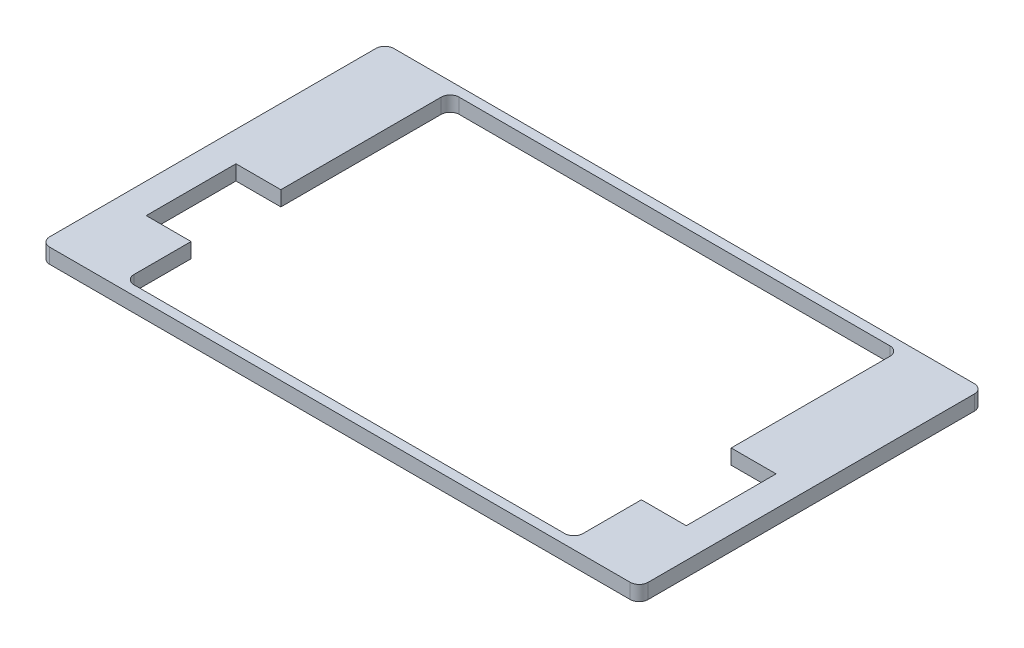
ISO-10303-21;
HEADER;
FILE_DESCRIPTION(('STEP AP214'),'2;1');
FILE_NAME('part.step','',(''),(''),'','','');
FILE_SCHEMA(('AUTOMOTIVE_DESIGN { 1 0 10303 214 1 1 1 1 }'));
ENDSEC;
DATA;
#1=APPLICATION_CONTEXT('core data for automotive mechanical design processes');
#2=APPLICATION_PROTOCOL_DEFINITION('international standard','automotive_design',2000,#1);
#3=PRODUCT_CONTEXT('',#1,'mechanical');
#4=PRODUCT('Part','Part','',(#3));
#5=PRODUCT_RELATED_PRODUCT_CATEGORY('part','',(#4));
#6=PRODUCT_DEFINITION_FORMATION('','',#4);
#7=PRODUCT_DEFINITION_CONTEXT('part definition',#1,'design');
#8=PRODUCT_DEFINITION('design','',#6,#7);
#9=PRODUCT_DEFINITION_SHAPE('','',#8);
#10=(LENGTH_UNIT() NAMED_UNIT(*) SI_UNIT(.MILLI.,.METRE.));
#11=(NAMED_UNIT(*) PLANE_ANGLE_UNIT() SI_UNIT($,.RADIAN.));
#12=(NAMED_UNIT(*) SI_UNIT($,.STERADIAN.) SOLID_ANGLE_UNIT());
#13=UNCERTAINTY_MEASURE_WITH_UNIT(LENGTH_MEASURE(1.E-05),#10,'distance_accuracy_value','');
#14=(GEOMETRIC_REPRESENTATION_CONTEXT(3) GLOBAL_UNCERTAINTY_ASSIGNED_CONTEXT((#13)) GLOBAL_UNIT_ASSIGNED_CONTEXT((#10,
#11,#12)) REPRESENTATION_CONTEXT('',''));
#15=CARTESIAN_POINT('',(0.,0.,0.));
#16=DIRECTION('',(0.,0.,1.));
#17=DIRECTION('',(1.,0.,0.));
#18=AXIS2_PLACEMENT_3D('',#15,#16,#17);
#19=CARTESIAN_POINT('',(222.25,6.35,-138.215));
#20=DIRECTION('',(-1.,0.,0.));
#21=DIRECTION('',(0.,0.,1.));
#22=AXIS2_PLACEMENT_3D('',#19,#20,#21);
#23=PLANE('',#22);
#24=DIRECTION('',(0.,-1.,0.));
#25=VECTOR('',#24,1.);
#26=CARTESIAN_POINT('',(222.25,6.35,-32.7024999999999));
#27=LINE('',#26,#25);
#28=CARTESIAN_POINT('',(222.25,6.35,-32.7024999999999));
#29=VERTEX_POINT('',#28);
#30=CARTESIAN_POINT('',(222.25,0.,-32.7024999999999));
#31=VERTEX_POINT('',#30);
#32=EDGE_CURVE('E226',#29,#31,#27,.T.);
#33=ORIENTED_EDGE('',*,*,#32,.T.);
#34=DIRECTION('',(0.,0.,-1.));
#35=VECTOR('',#34,1.);
#36=CARTESIAN_POINT('',(222.25,0.,-138.215));
#37=LINE('',#36,#35);
#38=CARTESIAN_POINT('',(222.25,0.,-7.835));
#39=VERTEX_POINT('',#38);
#40=EDGE_CURVE('E286',#39,#31,#37,.T.);
#41=ORIENTED_EDGE('',*,*,#40,.F.);
#42=DIRECTION('',(0.,-1.,0.));
#43=VECTOR('',#42,1.);
#44=CARTESIAN_POINT('',(222.25,6.35,-7.835));
#45=LINE('',#44,#43);
#46=CARTESIAN_POINT('',(222.25,6.35,-7.835));
#47=VERTEX_POINT('',#46);
#48=EDGE_CURVE('E312',#47,#39,#45,.T.);
#49=ORIENTED_EDGE('',*,*,#48,.F.);
#50=DIRECTION('',(0.,0.,-1.));
#51=VECTOR('',#50,1.);
#52=CARTESIAN_POINT('',(222.25,6.35,-138.215));
#53=LINE('',#52,#51);
#54=EDGE_CURVE('E262',#47,#29,#53,.T.);
#55=ORIENTED_EDGE('',*,*,#54,.T.);
#56=EDGE_LOOP('',(#33,#41,#49,#55));
#57=FACE_BOUND('',#56,.T.);
#58=ADVANCED_FACE('F34',(#57),#23,.T.);
#59=CARTESIAN_POINT('',(31.7500000000001,6.35,-138.215));
#60=DIRECTION('',(1.,0.,0.));
#61=DIRECTION('',(0.,0.,-1.));
#62=AXIS2_PLACEMENT_3D('',#59,#60,#61);
#63=PLANE('',#62);
#64=DIRECTION('',(0.,-1.,0.));
#65=VECTOR('',#64,1.);
#66=CARTESIAN_POINT('',(31.7500000000001,6.35,-70.1674999999999));
#67=LINE('',#66,#65);
#68=CARTESIAN_POINT('',(31.7500000000001,6.35,-70.1674999999999));
#69=VERTEX_POINT('',#68);
#70=CARTESIAN_POINT('',(31.7500000000001,0.,-70.1674999999999));
#71=VERTEX_POINT('',#70);
#72=EDGE_CURVE('E224',#69,#71,#67,.T.);
#73=ORIENTED_EDGE('',*,*,#72,.T.);
#74=DIRECTION('',(0.,0.,1.));
#75=VECTOR('',#74,1.);
#76=CARTESIAN_POINT('',(31.7500000000001,0.,-138.215));
#77=LINE('',#76,#75);
#78=CARTESIAN_POINT('',(31.7500000000001,0.,-138.215));
#79=VERTEX_POINT('',#78);
#80=EDGE_CURVE('E258',#79,#71,#77,.T.);
#81=ORIENTED_EDGE('',*,*,#80,.F.);
#82=DIRECTION('',(0.,-1.,0.));
#83=VECTOR('',#82,1.);
#84=CARTESIAN_POINT('',(31.7500000000001,6.35,-138.215));
#85=LINE('',#84,#83);
#86=CARTESIAN_POINT('',(31.7500000000001,6.35,-138.215));
#87=VERTEX_POINT('',#86);
#88=EDGE_CURVE('E303',#87,#79,#85,.T.);
#89=ORIENTED_EDGE('',*,*,#88,.F.);
#90=DIRECTION('',(0.,0.,1.));
#91=VECTOR('',#90,1.);
#92=CARTESIAN_POINT('',(31.7500000000001,6.35,-138.215));
#93=LINE('',#92,#91);
#94=EDGE_CURVE('E273',#87,#69,#93,.T.);
#95=ORIENTED_EDGE('',*,*,#94,.T.);
#96=EDGE_LOOP('',(#73,#81,#89,#95));
#97=FACE_BOUND('',#96,.T.);
#98=ADVANCED_FACE('F420',(#97),#63,.T.);
#99=CARTESIAN_POINT('',(250.19,6.35,-3.81));
#100=DIRECTION('',(0.,1.,0.));
#101=DIRECTION('',(0.,0.,1.));
#102=AXIS2_PLACEMENT_3D('',#99,#100,#101);
#103=PLANE('',#102);
#104=DIRECTION('',(-1.,0.,0.));
#105=VECTOR('',#104,1.);
#106=CARTESIAN_POINT('',(222.25,6.35,-32.7024999999999));
#107=LINE('',#106,#105);
#108=CARTESIAN_POINT('',(241.3,6.35,-32.7024999999999));
#109=VERTEX_POINT('',#108);
#110=EDGE_CURVE('E210',#109,#29,#107,.T.);
#111=ORIENTED_EDGE('',*,*,#110,.T.);
#112=ORIENTED_EDGE('',*,*,#54,.F.);
#113=CARTESIAN_POINT('',(218.44,6.35,-7.835));
#114=DIRECTION('',(0.,1.,0.));
#115=DIRECTION('',(0.,0.,1.));
#116=AXIS2_PLACEMENT_3D('',#113,#114,#115);
#117=CIRCLE('',#116,3.81000000000002);
#118=CARTESIAN_POINT('',(218.44,6.35,-4.02499999999998));
#119=VERTEX_POINT('',#118);
#120=EDGE_CURVE('E260',#119,#47,#117,.T.);
#121=ORIENTED_EDGE('',*,*,#120,.F.);
#122=DIRECTION('',(1.,0.,0.));
#123=VECTOR('',#122,1.);
#124=CARTESIAN_POINT('',(35.5600000000001,6.35,-4.025));
#125=LINE('',#124,#123);
#126=CARTESIAN_POINT('',(35.5600000000001,6.35,-4.025));
#127=VERTEX_POINT('',#126);
#128=EDGE_CURVE('E257',#127,#119,#125,.T.);
#129=ORIENTED_EDGE('',*,*,#128,.F.);
#130=CARTESIAN_POINT('',(35.5600000000001,6.35,-7.835));
#131=DIRECTION('',(0.,1.,0.));
#132=DIRECTION('',(0.,0.,1.));
#133=AXIS2_PLACEMENT_3D('',#130,#131,#132);
#134=CIRCLE('',#133,3.81);
#135=CARTESIAN_POINT('',(31.7500000000001,6.35,-7.835));
#136=VERTEX_POINT('',#135);
#137=EDGE_CURVE('E255',#136,#127,#134,.T.);
#138=ORIENTED_EDGE('',*,*,#137,.F.);
#139=CARTESIAN_POINT('',(31.7500000000001,6.35,-32.0674999999999));
#140=VERTEX_POINT('',#139);
#141=EDGE_CURVE('E272',#140,#136,#93,.T.);
#142=ORIENTED_EDGE('',*,*,#141,.F.);
#143=DIRECTION('',(-1.,0.,0.));
#144=VECTOR('',#143,1.);
#145=CARTESIAN_POINT('',(31.7500000000001,6.35,-32.0674999999999));
#146=LINE('',#145,#144);
#147=CARTESIAN_POINT('',(12.7000000000001,6.35,-32.0674999999999));
#148=VERTEX_POINT('',#147);
#149=EDGE_CURVE('E57',#140,#148,#146,.T.);
#150=ORIENTED_EDGE('',*,*,#149,.T.);
#151=DIRECTION('',(0.,0.,-1.));
#152=VECTOR('',#151,1.);
#153=CARTESIAN_POINT('',(12.7000000000001,6.35,-70.1674999999999));
#154=LINE('',#153,#152);
#155=CARTESIAN_POINT('',(12.7000000000001,6.35,-70.1674999999999));
#156=VERTEX_POINT('',#155);
#157=EDGE_CURVE('E233',#148,#156,#154,.T.);
#158=ORIENTED_EDGE('',*,*,#157,.T.);
#159=DIRECTION('',(1.,0.,0.));
#160=VECTOR('',#159,1.);
#161=CARTESIAN_POINT('',(31.7500000000001,6.35,-70.1674999999999));
#162=LINE('',#161,#160);
#163=EDGE_CURVE('E237',#156,#69,#162,.T.);
#164=ORIENTED_EDGE('',*,*,#163,.T.);
#165=ORIENTED_EDGE('',*,*,#94,.F.);
#166=CARTESIAN_POINT('',(35.5600000000001,6.35,-138.215));
#167=DIRECTION('',(0.,1.,0.));
#168=DIRECTION('',(0.,0.,1.));
#169=AXIS2_PLACEMENT_3D('',#166,#167,#168);
#170=CIRCLE('',#169,3.81);
#171=CARTESIAN_POINT('',(35.5600000000001,6.35,-142.025));
#172=VERTEX_POINT('',#171);
#173=EDGE_CURVE('E269',#172,#87,#170,.T.);
#174=ORIENTED_EDGE('',*,*,#173,.F.);
#175=DIRECTION('',(-1.,0.,0.));
#176=VECTOR('',#175,1.);
#177=CARTESIAN_POINT('',(35.5600000000001,6.35,-142.025));
#178=LINE('',#177,#176);
#179=CARTESIAN_POINT('',(218.44,6.35,-142.025));
#180=VERTEX_POINT('',#179);
#181=EDGE_CURVE('E267',#180,#172,#178,.T.);
#182=ORIENTED_EDGE('',*,*,#181,.F.);
#183=CARTESIAN_POINT('',(218.44,6.35,-138.215));
#184=DIRECTION('',(0.,1.,0.));
#185=DIRECTION('',(0.,0.,-1.));
#186=AXIS2_PLACEMENT_3D('',#183,#184,#185);
#187=CIRCLE('',#186,3.81000000000001);
#188=CARTESIAN_POINT('',(222.25,6.35,-138.215));
#189=VERTEX_POINT('',#188);
#190=EDGE_CURVE('E265',#189,#180,#187,.T.);
#191=ORIENTED_EDGE('',*,*,#190,.F.);
#192=CARTESIAN_POINT('',(222.25,6.35,-70.8024999999999));
#193=VERTEX_POINT('',#192);
#194=EDGE_CURVE('E216',#193,#189,#53,.T.);
#195=ORIENTED_EDGE('',*,*,#194,.F.);
#196=DIRECTION('',(1.,0.,0.));
#197=VECTOR('',#196,1.);
#198=CARTESIAN_POINT('',(222.25,6.35,-70.8024999999999));
#199=LINE('',#198,#197);
#200=CARTESIAN_POINT('',(241.3,6.35,-70.8024999999999));
#201=VERTEX_POINT('',#200);
#202=EDGE_CURVE('E49',#193,#201,#199,.T.);
#203=ORIENTED_EDGE('',*,*,#202,.T.);
#204=DIRECTION('',(0.,0.,1.));
#205=VECTOR('',#204,1.);
#206=CARTESIAN_POINT('',(241.3,6.35,-70.8024999999999));
#207=LINE('',#206,#205);
#208=EDGE_CURVE('E205',#201,#109,#207,.T.);
#209=ORIENTED_EDGE('',*,*,#208,.T.);
#210=EDGE_LOOP('',(#111,#112,#121,#129,#138,#142,#150,#158,#164,#165,#174,#182,#191,#195,#203,#209));
#211=FACE_BOUND('',#210,.T.);
#212=CARTESIAN_POINT('',(250.19,6.35,-3.81));
#213=DIRECTION('',(0.,1.,0.));
#214=DIRECTION('',(0.,0.,1.));
#215=AXIS2_PLACEMENT_3D('',#212,#213,#214);
#216=CIRCLE('',#215,3.80999999999999);
#217=CARTESIAN_POINT('',(250.19,6.35,0.));
#218=VERTEX_POINT('',#217);
#219=CARTESIAN_POINT('',(254.,6.35,-3.81));
#220=VERTEX_POINT('',#219);
#221=EDGE_CURVE('E320',#218,#220,#216,.T.);
#222=ORIENTED_EDGE('',*,*,#221,.T.);
#223=DIRECTION('',(0.,0.,-1.));
#224=VECTOR('',#223,1.);
#225=CARTESIAN_POINT('',(254.,6.35,-3.81));
#226=LINE('',#225,#224);
#227=CARTESIAN_POINT('',(254.,6.35,-142.24));
#228=VERTEX_POINT('',#227);
#229=EDGE_CURVE('E323',#220,#228,#226,.T.);
#230=ORIENTED_EDGE('',*,*,#229,.T.);
#231=CARTESIAN_POINT('',(250.19,6.35,-142.24));
#232=DIRECTION('',(0.,1.,0.));
#233=DIRECTION('',(0.,0.,-1.));
#234=AXIS2_PLACEMENT_3D('',#231,#232,#233);
#235=CIRCLE('',#234,3.81000000000002);
#236=CARTESIAN_POINT('',(250.19,6.35,-146.05));
#237=VERTEX_POINT('',#236);
#238=EDGE_CURVE('E326',#228,#237,#235,.T.);
#239=ORIENTED_EDGE('',*,*,#238,.T.);
#240=DIRECTION('',(-1.,0.,0.));
#241=VECTOR('',#240,1.);
#242=CARTESIAN_POINT('',(3.81,6.35,-146.05));
#243=LINE('',#242,#241);
#244=CARTESIAN_POINT('',(3.81,6.35,-146.05));
#245=VERTEX_POINT('',#244);
#246=EDGE_CURVE('E328',#237,#245,#243,.T.);
#247=ORIENTED_EDGE('',*,*,#246,.T.);
#248=CARTESIAN_POINT('',(3.81,6.35,-142.24));
#249=DIRECTION('',(0.,1.,0.));
#250=DIRECTION('',(0.,0.,-1.));
#251=AXIS2_PLACEMENT_3D('',#248,#249,#250);
#252=CIRCLE('',#251,3.81);
#253=CARTESIAN_POINT('',(0.,6.35,-142.24));
#254=VERTEX_POINT('',#253);
#255=EDGE_CURVE('E330',#245,#254,#252,.T.);
#256=ORIENTED_EDGE('',*,*,#255,.T.);
#257=DIRECTION('',(0.,0.,1.));
#258=VECTOR('',#257,1.);
#259=CARTESIAN_POINT('',(0.,6.35,-3.81000000000003));
#260=LINE('',#259,#258);
#261=CARTESIAN_POINT('',(0.,6.35,-3.81000000000003));
#262=VERTEX_POINT('',#261);
#263=EDGE_CURVE('E332',#254,#262,#260,.T.);
#264=ORIENTED_EDGE('',*,*,#263,.T.);
#265=CARTESIAN_POINT('',(3.81,6.35,-3.81));
#266=DIRECTION('',(0.,1.,0.));
#267=DIRECTION('',(0.,0.,-1.));
#268=AXIS2_PLACEMENT_3D('',#265,#266,#267);
#269=CIRCLE('',#268,3.81);
#270=CARTESIAN_POINT('',(3.81000000000003,6.35,0.));
#271=VERTEX_POINT('',#270);
#272=EDGE_CURVE('E334',#262,#271,#269,.T.);
#273=ORIENTED_EDGE('',*,*,#272,.T.);
#274=DIRECTION('',(1.,0.,0.));
#275=VECTOR('',#274,1.);
#276=CARTESIAN_POINT('',(3.81000000000003,6.35,0.));
#277=LINE('',#276,#275);
#278=EDGE_CURVE('E336',#271,#218,#277,.T.);
#279=ORIENTED_EDGE('',*,*,#278,.T.);
#280=EDGE_LOOP('',(#222,#230,#239,#247,#256,#264,#273,#279));
#281=FACE_BOUND('',#280,.T.);
#282=ADVANCED_FACE('F213',(#211,#281),#103,.T.);
#283=CARTESIAN_POINT('',(250.19,0.,-3.81));
#284=DIRECTION('',(0.,1.,0.));
#285=DIRECTION('',(0.,0.,1.));
#286=AXIS2_PLACEMENT_3D('',#283,#284,#285);
#287=PLANE('',#286);
#288=CARTESIAN_POINT('',(250.19,0.,-3.81));
#289=DIRECTION('',(0.,1.,0.));
#290=DIRECTION('',(0.,0.,1.));
#291=AXIS2_PLACEMENT_3D('',#288,#289,#290);
#292=CIRCLE('',#291,3.80999999999999);
#293=CARTESIAN_POINT('',(250.19,0.,0.));
#294=VERTEX_POINT('',#293);
#295=CARTESIAN_POINT('',(254.,0.,-3.81));
#296=VERTEX_POINT('',#295);
#297=EDGE_CURVE('E319',#294,#296,#292,.T.);
#298=ORIENTED_EDGE('',*,*,#297,.F.);
#299=DIRECTION('',(1.,0.,0.));
#300=VECTOR('',#299,1.);
#301=CARTESIAN_POINT('',(3.81000000000003,0.,0.));
#302=LINE('',#301,#300);
#303=CARTESIAN_POINT('',(3.81000000000003,0.,0.));
#304=VERTEX_POINT('',#303);
#305=EDGE_CURVE('E324',#304,#294,#302,.T.);
#306=ORIENTED_EDGE('',*,*,#305,.F.);
#307=CARTESIAN_POINT('',(3.81,0.,-3.81));
#308=DIRECTION('',(0.,1.,0.));
#309=DIRECTION('',(0.,0.,-1.));
#310=AXIS2_PLACEMENT_3D('',#307,#308,#309);
#311=CIRCLE('',#310,3.81);
#312=CARTESIAN_POINT('',(0.,0.,-3.81000000000003));
#313=VERTEX_POINT('',#312);
#314=EDGE_CURVE('E351',#313,#304,#311,.T.);
#315=ORIENTED_EDGE('',*,*,#314,.F.);
#316=DIRECTION('',(0.,0.,1.));
#317=VECTOR('',#316,1.);
#318=CARTESIAN_POINT('',(0.,0.,-3.81000000000003));
#319=LINE('',#318,#317);
#320=CARTESIAN_POINT('',(0.,0.,-142.24));
#321=VERTEX_POINT('',#320);
#322=EDGE_CURVE('E349',#321,#313,#319,.T.);
#323=ORIENTED_EDGE('',*,*,#322,.F.);
#324=CARTESIAN_POINT('',(3.81,0.,-142.24));
#325=DIRECTION('',(0.,1.,0.));
#326=DIRECTION('',(0.,0.,-1.));
#327=AXIS2_PLACEMENT_3D('',#324,#325,#326);
#328=CIRCLE('',#327,3.81);
#329=CARTESIAN_POINT('',(3.81,0.,-146.05));
#330=VERTEX_POINT('',#329);
#331=EDGE_CURVE('E347',#330,#321,#328,.T.);
#332=ORIENTED_EDGE('',*,*,#331,.F.);
#333=DIRECTION('',(-1.,0.,0.));
#334=VECTOR('',#333,1.);
#335=CARTESIAN_POINT('',(3.81,0.,-146.05));
#336=LINE('',#335,#334);
#337=CARTESIAN_POINT('',(250.19,0.,-146.05));
#338=VERTEX_POINT('',#337);
#339=EDGE_CURVE('E345',#338,#330,#336,.T.);
#340=ORIENTED_EDGE('',*,*,#339,.F.);
#341=CARTESIAN_POINT('',(250.19,0.,-142.24));
#342=DIRECTION('',(0.,1.,0.));
#343=DIRECTION('',(0.,0.,-1.));
#344=AXIS2_PLACEMENT_3D('',#341,#342,#343);
#345=CIRCLE('',#344,3.81000000000002);
#346=CARTESIAN_POINT('',(254.,0.,-142.24));
#347=VERTEX_POINT('',#346);
#348=EDGE_CURVE('E343',#347,#338,#345,.T.);
#349=ORIENTED_EDGE('',*,*,#348,.F.);
#350=DIRECTION('',(0.,0.,-1.));
#351=VECTOR('',#350,1.);
#352=CARTESIAN_POINT('',(254.,0.,-3.81));
#353=LINE('',#352,#351);
#354=EDGE_CURVE('E341',#296,#347,#353,.T.);
#355=ORIENTED_EDGE('',*,*,#354,.F.);
#356=EDGE_LOOP('',(#298,#306,#315,#323,#332,#340,#349,#355));
#357=FACE_BOUND('',#356,.T.);
#358=ORIENTED_EDGE('',*,*,#40,.T.);
#359=DIRECTION('',(-1.,0.,0.));
#360=VECTOR('',#359,1.);
#361=CARTESIAN_POINT('',(222.25,0.,-32.7024999999999));
#362=LINE('',#361,#360);
#363=CARTESIAN_POINT('',(241.3,0.,-32.7024999999999));
#364=VERTEX_POINT('',#363);
#365=EDGE_CURVE('E217',#364,#31,#362,.T.);
#366=ORIENTED_EDGE('',*,*,#365,.F.);
#367=DIRECTION('',(0.,0.,1.));
#368=VECTOR('',#367,1.);
#369=CARTESIAN_POINT('',(241.3,0.,-70.8024999999999));
#370=LINE('',#369,#368);
#371=CARTESIAN_POINT('',(241.3,0.,-70.8024999999999));
#372=VERTEX_POINT('',#371);
#373=EDGE_CURVE('E219',#372,#364,#370,.T.);
#374=ORIENTED_EDGE('',*,*,#373,.F.);
#375=DIRECTION('',(1.,0.,0.));
#376=VECTOR('',#375,1.);
#377=CARTESIAN_POINT('',(222.25,0.,-70.8024999999999));
#378=LINE('',#377,#376);
#379=CARTESIAN_POINT('',(222.25,0.,-70.8024999999999));
#380=VERTEX_POINT('',#379);
#381=EDGE_CURVE('E197',#380,#372,#378,.T.);
#382=ORIENTED_EDGE('',*,*,#381,.F.);
#383=CARTESIAN_POINT('',(222.25,0.,-138.215));
#384=VERTEX_POINT('',#383);
#385=EDGE_CURVE('E285',#380,#384,#37,.T.);
#386=ORIENTED_EDGE('',*,*,#385,.T.);
#387=CARTESIAN_POINT('',(218.44,0.,-138.215));
#388=DIRECTION('',(0.,1.,0.));
#389=DIRECTION('',(0.,0.,-1.));
#390=AXIS2_PLACEMENT_3D('',#387,#388,#389);
#391=CIRCLE('',#390,3.81000000000001);
#392=CARTESIAN_POINT('',(218.44,0.,-142.025));
#393=VERTEX_POINT('',#392);
#394=EDGE_CURVE('E289',#384,#393,#391,.T.);
#395=ORIENTED_EDGE('',*,*,#394,.T.);
#396=DIRECTION('',(-1.,0.,0.));
#397=VECTOR('',#396,1.);
#398=CARTESIAN_POINT('',(35.5600000000001,0.,-142.025));
#399=LINE('',#398,#397);
#400=CARTESIAN_POINT('',(35.5600000000001,0.,-142.025));
#401=VERTEX_POINT('',#400);
#402=EDGE_CURVE('E292',#393,#401,#399,.T.);
#403=ORIENTED_EDGE('',*,*,#402,.T.);
#404=CARTESIAN_POINT('',(35.5600000000001,0.,-138.215));
#405=DIRECTION('',(0.,1.,0.));
#406=DIRECTION('',(0.,0.,1.));
#407=AXIS2_PLACEMENT_3D('',#404,#405,#406);
#408=CIRCLE('',#407,3.81);
#409=EDGE_CURVE('E295',#401,#79,#408,.T.);
#410=ORIENTED_EDGE('',*,*,#409,.T.);
#411=ORIENTED_EDGE('',*,*,#80,.T.);
#412=DIRECTION('',(1.,0.,0.));
#413=VECTOR('',#412,1.);
#414=CARTESIAN_POINT('',(31.7500000000001,0.,-70.1674999999999));
#415=LINE('',#414,#413);
#416=CARTESIAN_POINT('',(12.7000000000001,0.,-70.1674999999999));
#417=VERTEX_POINT('',#416);
#418=EDGE_CURVE('E234',#417,#71,#415,.T.);
#419=ORIENTED_EDGE('',*,*,#418,.F.);
#420=DIRECTION('',(0.,0.,-1.));
#421=VECTOR('',#420,1.);
#422=CARTESIAN_POINT('',(12.7000000000001,0.,-70.1674999999999));
#423=LINE('',#422,#421);
#424=CARTESIAN_POINT('',(12.7000000000001,0.,-32.0674999999999));
#425=VERTEX_POINT('',#424);
#426=EDGE_CURVE('E244',#425,#417,#423,.T.);
#427=ORIENTED_EDGE('',*,*,#426,.F.);
#428=DIRECTION('',(-1.,0.,0.));
#429=VECTOR('',#428,1.);
#430=CARTESIAN_POINT('',(31.7500000000001,0.,-32.0674999999999));
#431=LINE('',#430,#429);
#432=CARTESIAN_POINT('',(31.7500000000001,0.,-32.0674999999999));
#433=VERTEX_POINT('',#432);
#434=EDGE_CURVE('E241',#433,#425,#431,.T.);
#435=ORIENTED_EDGE('',*,*,#434,.F.);
#436=CARTESIAN_POINT('',(31.7500000000001,0.,-7.835));
#437=VERTEX_POINT('',#436);
#438=EDGE_CURVE('E298',#433,#437,#77,.T.);
#439=ORIENTED_EDGE('',*,*,#438,.T.);
#440=CARTESIAN_POINT('',(35.5600000000001,0.,-7.835));
#441=DIRECTION('',(0.,1.,0.));
#442=DIRECTION('',(0.,0.,1.));
#443=AXIS2_PLACEMENT_3D('',#440,#441,#442);
#444=CIRCLE('',#443,3.81);
#445=CARTESIAN_POINT('',(35.5600000000001,0.,-4.025));
#446=VERTEX_POINT('',#445);
#447=EDGE_CURVE('E229',#437,#446,#444,.T.);
#448=ORIENTED_EDGE('',*,*,#447,.T.);
#449=DIRECTION('',(1.,0.,0.));
#450=VECTOR('',#449,1.);
#451=CARTESIAN_POINT('',(35.5600000000001,0.,-4.025));
#452=LINE('',#451,#450);
#453=CARTESIAN_POINT('',(218.44,0.,-4.02499999999998));
#454=VERTEX_POINT('',#453);
#455=EDGE_CURVE('E279',#446,#454,#452,.T.);
#456=ORIENTED_EDGE('',*,*,#455,.T.);
#457=CARTESIAN_POINT('',(218.44,0.,-7.835));
#458=DIRECTION('',(0.,1.,0.));
#459=DIRECTION('',(0.,0.,1.));
#460=AXIS2_PLACEMENT_3D('',#457,#458,#459);
#461=CIRCLE('',#460,3.81000000000002);
#462=EDGE_CURVE('E282',#454,#39,#461,.T.);
#463=ORIENTED_EDGE('',*,*,#462,.T.);
#464=EDGE_LOOP('',(#358,#366,#374,#382,#386,#395,#403,#410,#411,#419,#427,#435,#439,#448,#456,#463));
#465=FACE_BOUND('',#464,.T.);
#466=ADVANCED_FACE('F381',(#357,#465),#287,.F.);
#467=CARTESIAN_POINT('',(250.19,6.35,-3.81));
#468=DIRECTION('',(0.,-1.,0.));
#469=DIRECTION('',(0.,0.,-1.));
#470=AXIS2_PLACEMENT_3D('',#467,#468,#469);
#471=CYLINDRICAL_SURFACE('',#470,3.80999999999999);
#472=ORIENTED_EDGE('',*,*,#297,.T.);
#473=DIRECTION('',(0.,-1.,0.));
#474=VECTOR('',#473,1.);
#475=CARTESIAN_POINT('',(254.,6.35,-3.81));
#476=LINE('',#475,#474);
#477=EDGE_CURVE('E11',#220,#296,#476,.T.);
#478=ORIENTED_EDGE('',*,*,#477,.F.);
#479=ORIENTED_EDGE('',*,*,#221,.F.);
#480=DIRECTION('',(0.,-1.,0.));
#481=VECTOR('',#480,1.);
#482=CARTESIAN_POINT('',(250.19,6.35,0.));
#483=LINE('',#482,#481);
#484=EDGE_CURVE('E338',#218,#294,#483,.T.);
#485=ORIENTED_EDGE('',*,*,#484,.T.);
#486=EDGE_LOOP('',(#472,#478,#479,#485));
#487=FACE_BOUND('',#486,.T.);
#488=ADVANCED_FACE('F36',(#487),#471,.T.);
#489=CARTESIAN_POINT('',(254.,6.35,-3.81));
#490=DIRECTION('',(-1.,0.,0.));
#491=DIRECTION('',(0.,0.,1.));
#492=AXIS2_PLACEMENT_3D('',#489,#490,#491);
#493=PLANE('',#492);
#494=ORIENTED_EDGE('',*,*,#354,.T.);
#495=DIRECTION('',(0.,-1.,0.));
#496=VECTOR('',#495,1.);
#497=CARTESIAN_POINT('',(254.,6.35,-142.24));
#498=LINE('',#497,#496);
#499=EDGE_CURVE('E42',#228,#347,#498,.T.);
#500=ORIENTED_EDGE('',*,*,#499,.F.);
#501=ORIENTED_EDGE('',*,*,#229,.F.);
#502=ORIENTED_EDGE('',*,*,#477,.T.);
#503=EDGE_LOOP('',(#494,#500,#501,#502));
#504=FACE_BOUND('',#503,.T.);
#505=ADVANCED_FACE('F397',(#504),#493,.F.);
#506=CARTESIAN_POINT('',(250.19,6.35,-142.24));
#507=DIRECTION('',(0.,-1.,0.));
#508=DIRECTION('',(0.,0.,-1.));
#509=AXIS2_PLACEMENT_3D('',#506,#507,#508);
#510=CYLINDRICAL_SURFACE('',#509,3.81000000000002);
#511=ORIENTED_EDGE('',*,*,#348,.T.);
#512=DIRECTION('',(0.,-1.,0.));
#513=VECTOR('',#512,1.);
#514=CARTESIAN_POINT('',(250.19,6.35,-146.05));
#515=LINE('',#514,#513);
#516=EDGE_CURVE('E368',#237,#338,#515,.T.);
#517=ORIENTED_EDGE('',*,*,#516,.F.);
#518=ORIENTED_EDGE('',*,*,#238,.F.);
#519=ORIENTED_EDGE('',*,*,#499,.T.);
#520=EDGE_LOOP('',(#511,#517,#518,#519));
#521=FACE_BOUND('',#520,.T.);
#522=ADVANCED_FACE('F375',(#521),#510,.T.);
#523=CARTESIAN_POINT('',(3.81,6.35,-146.05));
#524=DIRECTION('',(0.,0.,1.));
#525=DIRECTION('',(1.,0.,0.));
#526=AXIS2_PLACEMENT_3D('',#523,#524,#525);
#527=PLANE('',#526);
#528=ORIENTED_EDGE('',*,*,#339,.T.);
#529=DIRECTION('',(0.,-1.,0.));
#530=VECTOR('',#529,1.);
#531=CARTESIAN_POINT('',(3.81,6.35,-146.05));
#532=LINE('',#531,#530);
#533=EDGE_CURVE('E365',#245,#330,#532,.T.);
#534=ORIENTED_EDGE('',*,*,#533,.F.);
#535=ORIENTED_EDGE('',*,*,#246,.F.);
#536=ORIENTED_EDGE('',*,*,#516,.T.);
#537=EDGE_LOOP('',(#528,#534,#535,#536));
#538=FACE_BOUND('',#537,.T.);
#539=ADVANCED_FACE('F387',(#538),#527,.F.);
#540=CARTESIAN_POINT('',(3.81,6.35,-142.24));
#541=DIRECTION('',(0.,-1.,0.));
#542=DIRECTION('',(0.,0.,-1.));
#543=AXIS2_PLACEMENT_3D('',#540,#541,#542);
#544=CYLINDRICAL_SURFACE('',#543,3.81);
#545=ORIENTED_EDGE('',*,*,#331,.T.);
#546=DIRECTION('',(0.,-1.,0.));
#547=VECTOR('',#546,1.);
#548=CARTESIAN_POINT('',(0.,6.35,-142.24));
#549=LINE('',#548,#547);
#550=EDGE_CURVE('E362',#254,#321,#549,.T.);
#551=ORIENTED_EDGE('',*,*,#550,.F.);
#552=ORIENTED_EDGE('',*,*,#255,.F.);
#553=ORIENTED_EDGE('',*,*,#533,.T.);
#554=EDGE_LOOP('',(#545,#551,#552,#553));
#555=FACE_BOUND('',#554,.T.);
#556=ADVANCED_FACE('F391',(#555),#544,.T.);
#557=CARTESIAN_POINT('',(0.,6.35,-3.81000000000003));
#558=DIRECTION('',(1.,0.,0.));
#559=DIRECTION('',(0.,0.,-1.));
#560=AXIS2_PLACEMENT_3D('',#557,#558,#559);
#561=PLANE('',#560);
#562=ORIENTED_EDGE('',*,*,#322,.T.);
#563=DIRECTION('',(0.,-1.,0.));
#564=VECTOR('',#563,1.);
#565=CARTESIAN_POINT('',(0.,6.35,-3.81000000000003));
#566=LINE('',#565,#564);
#567=EDGE_CURVE('E359',#262,#313,#566,.T.);
#568=ORIENTED_EDGE('',*,*,#567,.F.);
#569=ORIENTED_EDGE('',*,*,#263,.F.);
#570=ORIENTED_EDGE('',*,*,#550,.T.);
#571=EDGE_LOOP('',(#562,#568,#569,#570));
#572=FACE_BOUND('',#571,.T.);
#573=ADVANCED_FACE('F410',(#572),#561,.F.);
#574=CARTESIAN_POINT('',(3.81,6.35,-3.81));
#575=DIRECTION('',(0.,-1.,0.));
#576=DIRECTION('',(0.,0.,-1.));
#577=AXIS2_PLACEMENT_3D('',#574,#575,#576);
#578=CYLINDRICAL_SURFACE('',#577,3.81);
#579=ORIENTED_EDGE('',*,*,#314,.T.);
#580=DIRECTION('',(0.,-1.,0.));
#581=VECTOR('',#580,1.);
#582=CARTESIAN_POINT('',(3.81000000000003,6.35,0.));
#583=LINE('',#582,#581);
#584=EDGE_CURVE('E356',#271,#304,#583,.T.);
#585=ORIENTED_EDGE('',*,*,#584,.F.);
#586=ORIENTED_EDGE('',*,*,#272,.F.);
#587=ORIENTED_EDGE('',*,*,#567,.T.);
#588=EDGE_LOOP('',(#579,#585,#586,#587));
#589=FACE_BOUND('',#588,.T.);
#590=ADVANCED_FACE('F408',(#589),#578,.T.);
#591=CARTESIAN_POINT('',(3.81000000000003,6.35,0.));
#592=DIRECTION('',(0.,0.,-1.));
#593=DIRECTION('',(-1.,0.,0.));
#594=AXIS2_PLACEMENT_3D('',#591,#592,#593);
#595=PLANE('',#594);
#596=ORIENTED_EDGE('',*,*,#305,.T.);
#597=ORIENTED_EDGE('',*,*,#484,.F.);
#598=ORIENTED_EDGE('',*,*,#278,.F.);
#599=ORIENTED_EDGE('',*,*,#584,.T.);
#600=EDGE_LOOP('',(#596,#597,#598,#599));
#601=FACE_BOUND('',#600,.T.);
#602=ADVANCED_FACE('F403',(#601),#595,.F.);
#603=CARTESIAN_POINT('',(35.5600000000001,6.35,-7.835));
#604=DIRECTION('',(0.,-1.,0.));
#605=DIRECTION('',(0.,0.,-1.));
#606=AXIS2_PLACEMENT_3D('',#603,#604,#605);
#607=CYLINDRICAL_SURFACE('',#606,3.81);
#608=ORIENTED_EDGE('',*,*,#447,.F.);
#609=DIRECTION('',(0.,-1.,0.));
#610=VECTOR('',#609,1.);
#611=CARTESIAN_POINT('',(31.7500000000001,6.35,-7.835));
#612=LINE('',#611,#610);
#613=EDGE_CURVE('E276',#136,#437,#612,.T.);
#614=ORIENTED_EDGE('',*,*,#613,.F.);
#615=ORIENTED_EDGE('',*,*,#137,.T.);
#616=DIRECTION('',(0.,-1.,0.));
#617=VECTOR('',#616,1.);
#618=CARTESIAN_POINT('',(35.5600000000001,6.35,-4.025));
#619=LINE('',#618,#617);
#620=EDGE_CURVE('E316',#127,#446,#619,.T.);
#621=ORIENTED_EDGE('',*,*,#620,.T.);
#622=EDGE_LOOP('',(#608,#614,#615,#621));
#623=FACE_BOUND('',#622,.T.);
#624=ADVANCED_FACE('F461',(#623),#607,.F.);
#625=CARTESIAN_POINT('',(35.5600000000001,6.35,-4.025));
#626=DIRECTION('',(0.,0.,-1.));
#627=DIRECTION('',(-1.,0.,0.));
#628=AXIS2_PLACEMENT_3D('',#625,#626,#627);
#629=PLANE('',#628);
#630=ORIENTED_EDGE('',*,*,#455,.F.);
#631=ORIENTED_EDGE('',*,*,#620,.F.);
#632=ORIENTED_EDGE('',*,*,#128,.T.);
#633=DIRECTION('',(0.,-1.,0.));
#634=VECTOR('',#633,1.);
#635=CARTESIAN_POINT('',(218.44,6.35,-4.02499999999998));
#636=LINE('',#635,#634);
#637=EDGE_CURVE('E314',#119,#454,#636,.T.);
#638=ORIENTED_EDGE('',*,*,#637,.T.);
#639=EDGE_LOOP('',(#630,#631,#632,#638));
#640=FACE_BOUND('',#639,.T.);
#641=ADVANCED_FACE('F442',(#640),#629,.T.);
#642=CARTESIAN_POINT('',(218.44,6.35,-7.835));
#643=DIRECTION('',(0.,-1.,0.));
#644=DIRECTION('',(0.,0.,-1.));
#645=AXIS2_PLACEMENT_3D('',#642,#643,#644);
#646=CYLINDRICAL_SURFACE('',#645,3.81000000000002);
#647=ORIENTED_EDGE('',*,*,#462,.F.);
#648=ORIENTED_EDGE('',*,*,#637,.F.);
#649=ORIENTED_EDGE('',*,*,#120,.T.);
#650=ORIENTED_EDGE('',*,*,#48,.T.);
#651=EDGE_LOOP('',(#647,#648,#649,#650));
#652=FACE_BOUND('',#651,.T.);
#653=ADVANCED_FACE('F434',(#652),#646,.F.);
#654=DIRECTION('',(0.,-1.,0.));
#655=VECTOR('',#654,1.);
#656=CARTESIAN_POINT('',(222.25,6.35,-70.8024999999999));
#657=LINE('',#656,#655);
#658=EDGE_CURVE('E202',#193,#380,#657,.T.);
#659=ORIENTED_EDGE('',*,*,#658,.F.);
#660=ORIENTED_EDGE('',*,*,#194,.T.);
#661=DIRECTION('',(0.,-1.,0.));
#662=VECTOR('',#661,1.);
#663=CARTESIAN_POINT('',(222.25,6.35,-138.215));
#664=LINE('',#663,#662);
#665=EDGE_CURVE('E309',#189,#384,#664,.T.);
#666=ORIENTED_EDGE('',*,*,#665,.T.);
#667=ORIENTED_EDGE('',*,*,#385,.F.);
#668=EDGE_LOOP('',(#659,#660,#666,#667));
#669=FACE_BOUND('',#668,.T.);
#670=ADVANCED_FACE('F423',(#669),#23,.T.);
#671=CARTESIAN_POINT('',(218.44,6.35,-138.215));
#672=DIRECTION('',(0.,-1.,0.));
#673=DIRECTION('',(0.,0.,-1.));
#674=AXIS2_PLACEMENT_3D('',#671,#672,#673);
#675=CYLINDRICAL_SURFACE('',#674,3.81000000000001);
#676=ORIENTED_EDGE('',*,*,#394,.F.);
#677=ORIENTED_EDGE('',*,*,#665,.F.);
#678=ORIENTED_EDGE('',*,*,#190,.T.);
#679=DIRECTION('',(0.,-1.,0.));
#680=VECTOR('',#679,1.);
#681=CARTESIAN_POINT('',(218.44,6.35,-142.025));
#682=LINE('',#681,#680);
#683=EDGE_CURVE('E307',#180,#393,#682,.T.);
#684=ORIENTED_EDGE('',*,*,#683,.T.);
#685=EDGE_LOOP('',(#676,#677,#678,#684));
#686=FACE_BOUND('',#685,.T.);
#687=ADVANCED_FACE('F433',(#686),#675,.F.);
#688=CARTESIAN_POINT('',(35.5600000000001,6.35,-142.025));
#689=DIRECTION('',(0.,0.,1.));
#690=DIRECTION('',(1.,0.,0.));
#691=AXIS2_PLACEMENT_3D('',#688,#689,#690);
#692=PLANE('',#691);
#693=ORIENTED_EDGE('',*,*,#402,.F.);
#694=ORIENTED_EDGE('',*,*,#683,.F.);
#695=ORIENTED_EDGE('',*,*,#181,.T.);
#696=DIRECTION('',(0.,-1.,0.));
#697=VECTOR('',#696,1.);
#698=CARTESIAN_POINT('',(35.5600000000001,6.35,-142.025));
#699=LINE('',#698,#697);
#700=EDGE_CURVE('E305',#172,#401,#699,.T.);
#701=ORIENTED_EDGE('',*,*,#700,.T.);
#702=EDGE_LOOP('',(#693,#694,#695,#701));
#703=FACE_BOUND('',#702,.T.);
#704=ADVANCED_FACE('F440',(#703),#692,.T.);
#705=CARTESIAN_POINT('',(35.5600000000001,6.35,-138.215));
#706=DIRECTION('',(0.,-1.,0.));
#707=DIRECTION('',(0.,0.,-1.));
#708=AXIS2_PLACEMENT_3D('',#705,#706,#707);
#709=CYLINDRICAL_SURFACE('',#708,3.81);
#710=ORIENTED_EDGE('',*,*,#409,.F.);
#711=ORIENTED_EDGE('',*,*,#700,.F.);
#712=ORIENTED_EDGE('',*,*,#173,.T.);
#713=ORIENTED_EDGE('',*,*,#88,.T.);
#714=EDGE_LOOP('',(#710,#711,#712,#713));
#715=FACE_BOUND('',#714,.T.);
#716=ADVANCED_FACE('F481',(#715),#709,.F.);
#717=DIRECTION('',(0.,-1.,0.));
#718=VECTOR('',#717,1.);
#719=CARTESIAN_POINT('',(31.7500000000001,6.35,-32.0674999999999));
#720=LINE('',#719,#718);
#721=EDGE_CURVE('E240',#140,#433,#720,.T.);
#722=ORIENTED_EDGE('',*,*,#721,.F.);
#723=ORIENTED_EDGE('',*,*,#141,.T.);
#724=ORIENTED_EDGE('',*,*,#613,.T.);
#725=ORIENTED_EDGE('',*,*,#438,.F.);
#726=EDGE_LOOP('',(#722,#723,#724,#725));
#727=FACE_BOUND('',#726,.T.);
#728=ADVANCED_FACE('F429',(#727),#63,.T.);
#729=CARTESIAN_POINT('',(31.7500000000001,6.35,-70.1674999999999));
#730=DIRECTION('',(0.,0.,-1.));
#731=DIRECTION('',(-1.,0.,0.));
#732=AXIS2_PLACEMENT_3D('',#729,#730,#731);
#733=PLANE('',#732);
#734=ORIENTED_EDGE('',*,*,#418,.T.);
#735=ORIENTED_EDGE('',*,*,#72,.F.);
#736=ORIENTED_EDGE('',*,*,#163,.F.);
#737=DIRECTION('',(0.,-1.,0.));
#738=VECTOR('',#737,1.);
#739=CARTESIAN_POINT('',(12.7000000000001,6.35,-70.1674999999999));
#740=LINE('',#739,#738);
#741=EDGE_CURVE('E250',#156,#417,#740,.T.);
#742=ORIENTED_EDGE('',*,*,#741,.T.);
#743=EDGE_LOOP('',(#734,#735,#736,#742));
#744=FACE_BOUND('',#743,.T.);
#745=ADVANCED_FACE('F475',(#744),#733,.F.);
#746=CARTESIAN_POINT('',(12.7000000000001,6.35,-70.1674999999999));
#747=DIRECTION('',(-1.,0.,0.));
#748=DIRECTION('',(0.,0.,1.));
#749=AXIS2_PLACEMENT_3D('',#746,#747,#748);
#750=PLANE('',#749);
#751=ORIENTED_EDGE('',*,*,#426,.T.);
#752=ORIENTED_EDGE('',*,*,#741,.F.);
#753=ORIENTED_EDGE('',*,*,#157,.F.);
#754=DIRECTION('',(0.,-1.,0.));
#755=VECTOR('',#754,1.);
#756=CARTESIAN_POINT('',(12.7000000000001,6.35,-32.0674999999999));
#757=LINE('',#756,#755);
#758=EDGE_CURVE('E252',#148,#425,#757,.T.);
#759=ORIENTED_EDGE('',*,*,#758,.T.);
#760=EDGE_LOOP('',(#751,#752,#753,#759));
#761=FACE_BOUND('',#760,.T.);
#762=ADVANCED_FACE('F472',(#761),#750,.F.);
#763=CARTESIAN_POINT('',(31.7500000000001,6.35,-32.0674999999999));
#764=DIRECTION('',(0.,0.,1.));
#765=DIRECTION('',(1.,0.,0.));
#766=AXIS2_PLACEMENT_3D('',#763,#764,#765);
#767=PLANE('',#766);
#768=ORIENTED_EDGE('',*,*,#434,.T.);
#769=ORIENTED_EDGE('',*,*,#758,.F.);
#770=ORIENTED_EDGE('',*,*,#149,.F.);
#771=ORIENTED_EDGE('',*,*,#721,.T.);
#772=EDGE_LOOP('',(#768,#769,#770,#771));
#773=FACE_BOUND('',#772,.T.);
#774=ADVANCED_FACE('F495',(#773),#767,.F.);
#775=CARTESIAN_POINT('',(222.25,6.35,-32.7024999999999));
#776=DIRECTION('',(0.,0.,1.));
#777=DIRECTION('',(1.,0.,0.));
#778=AXIS2_PLACEMENT_3D('',#775,#776,#777);
#779=PLANE('',#778);
#780=ORIENTED_EDGE('',*,*,#365,.T.);
#781=ORIENTED_EDGE('',*,*,#32,.F.);
#782=ORIENTED_EDGE('',*,*,#110,.F.);
#783=DIRECTION('',(0.,-1.,0.));
#784=VECTOR('',#783,1.);
#785=CARTESIAN_POINT('',(241.3,6.35,-32.7024999999999));
#786=LINE('',#785,#784);
#787=EDGE_CURVE('E201',#109,#364,#786,.T.);
#788=ORIENTED_EDGE('',*,*,#787,.T.);
#789=EDGE_LOOP('',(#780,#781,#782,#788));
#790=FACE_BOUND('',#789,.T.);
#791=ADVANCED_FACE('F449',(#790),#779,.F.);
#792=CARTESIAN_POINT('',(241.3,6.35,-70.8024999999999));
#793=DIRECTION('',(1.,0.,0.));
#794=DIRECTION('',(0.,0.,-1.));
#795=AXIS2_PLACEMENT_3D('',#792,#793,#794);
#796=PLANE('',#795);
#797=ORIENTED_EDGE('',*,*,#373,.T.);
#798=ORIENTED_EDGE('',*,*,#787,.F.);
#799=ORIENTED_EDGE('',*,*,#208,.F.);
#800=DIRECTION('',(0.,-1.,0.));
#801=VECTOR('',#800,1.);
#802=CARTESIAN_POINT('',(241.3,6.35,-70.8024999999999));
#803=LINE('',#802,#801);
#804=EDGE_CURVE('E193',#201,#372,#803,.T.);
#805=ORIENTED_EDGE('',*,*,#804,.T.);
#806=EDGE_LOOP('',(#797,#798,#799,#805));
#807=FACE_BOUND('',#806,.T.);
#808=ADVANCED_FACE('F206',(#807),#796,.F.);
#809=CARTESIAN_POINT('',(222.25,6.35,-70.8024999999999));
#810=DIRECTION('',(0.,0.,-1.));
#811=DIRECTION('',(-1.,0.,0.));
#812=AXIS2_PLACEMENT_3D('',#809,#810,#811);
#813=PLANE('',#812);
#814=ORIENTED_EDGE('',*,*,#381,.T.);
#815=ORIENTED_EDGE('',*,*,#804,.F.);
#816=ORIENTED_EDGE('',*,*,#202,.F.);
#817=ORIENTED_EDGE('',*,*,#658,.T.);
#818=EDGE_LOOP('',(#814,#815,#816,#817));
#819=FACE_BOUND('',#818,.T.);
#820=ADVANCED_FACE('F195',(#819),#813,.F.);
#821=CLOSED_SHELL('',(#58,#98,#282,#466,#488,#505,#522,#539,#556,#573,#590,#602,#624,#641,#653,
#670,#687,#704,#716,#728,#745,#762,#774,#791,#808,#820));
#822=MANIFOLD_SOLID_BREP('B2',#821);
#823=ADVANCED_BREP_SHAPE_REPRESENTATION('',(#18,#822),#14);
#824=SHAPE_DEFINITION_REPRESENTATION(#9,#823);
ENDSEC;
END-ISO-10303-21;
